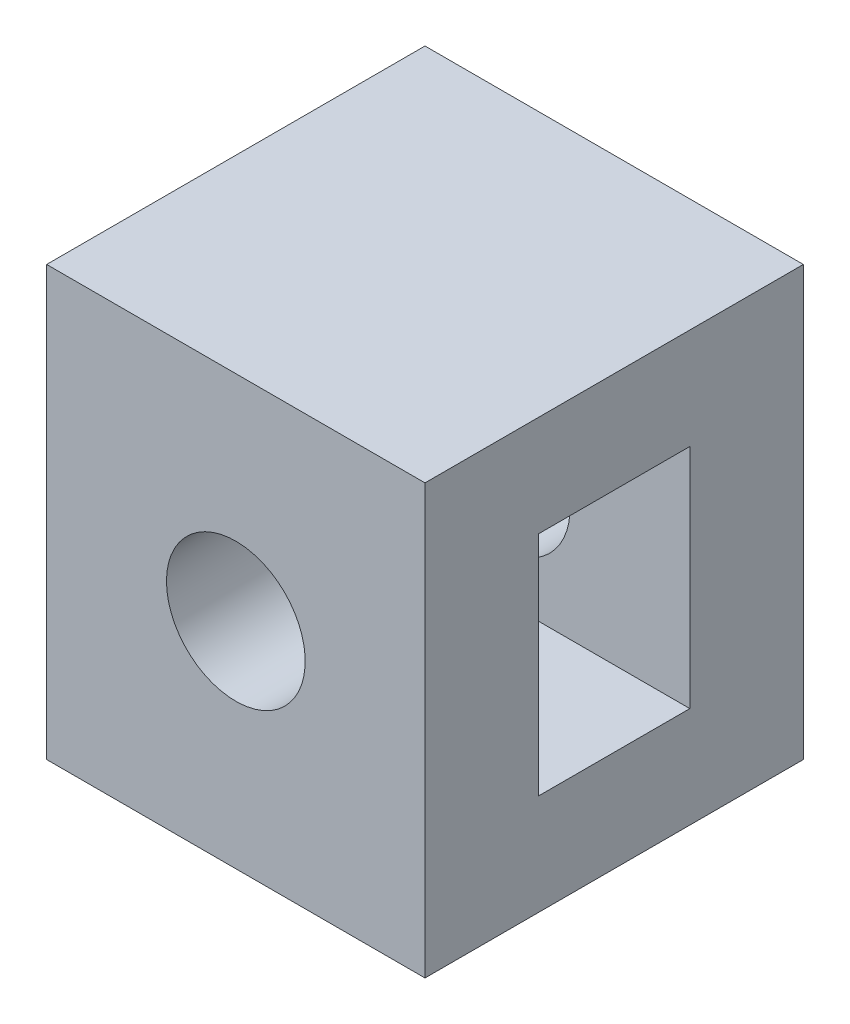
ISO-10303-21;
HEADER;
FILE_DESCRIPTION(('STEP AP214'),'2;1');
FILE_NAME('part.step','',(''),(''),'','','');
FILE_SCHEMA(('AUTOMOTIVE_DESIGN { 1 0 10303 214 1 1 1 1 }'));
ENDSEC;
DATA;
#1=APPLICATION_CONTEXT('core data for automotive mechanical design processes');
#2=APPLICATION_PROTOCOL_DEFINITION('international standard','automotive_design',2000,#1);
#3=PRODUCT_CONTEXT('',#1,'mechanical');
#4=PRODUCT('Part','Part','',(#3));
#5=PRODUCT_RELATED_PRODUCT_CATEGORY('part','',(#4));
#6=PRODUCT_DEFINITION_FORMATION('','',#4);
#7=PRODUCT_DEFINITION_CONTEXT('part definition',#1,'design');
#8=PRODUCT_DEFINITION('design','',#6,#7);
#9=PRODUCT_DEFINITION_SHAPE('','',#8);
#10=(LENGTH_UNIT() NAMED_UNIT(*) SI_UNIT(.MILLI.,.METRE.));
#11=(NAMED_UNIT(*) PLANE_ANGLE_UNIT() SI_UNIT($,.RADIAN.));
#12=(NAMED_UNIT(*) SI_UNIT($,.STERADIAN.) SOLID_ANGLE_UNIT());
#13=UNCERTAINTY_MEASURE_WITH_UNIT(LENGTH_MEASURE(1.E-05),#10,'distance_accuracy_value','');
#14=(GEOMETRIC_REPRESENTATION_CONTEXT(3) GLOBAL_UNCERTAINTY_ASSIGNED_CONTEXT((#13)) GLOBAL_UNIT_ASSIGNED_CONTEXT((#10,
#11,#12)) REPRESENTATION_CONTEXT('',''));
#15=CARTESIAN_POINT('',(0.,0.,0.));
#16=DIRECTION('',(0.,0.,1.));
#17=DIRECTION('',(1.,0.,0.));
#18=AXIS2_PLACEMENT_3D('',#15,#16,#17);
#19=CARTESIAN_POINT('',(0.,17.,15.));
#20=DIRECTION('',(1.,0.,0.));
#21=DIRECTION('',(0.,0.,-1.));
#22=AXIS2_PLACEMENT_3D('',#19,#20,#21);
#23=PLANE('',#22);
#24=DIRECTION('',(0.,0.,1.));
#25=VECTOR('',#24,1.);
#26=CARTESIAN_POINT('',(0.,0.,15.));
#27=LINE('',#26,#25);
#28=CARTESIAN_POINT('',(0.,0.,0.));
#29=VERTEX_POINT('',#28);
#30=CARTESIAN_POINT('',(0.,0.,15.));
#31=VERTEX_POINT('',#30);
#32=EDGE_CURVE('E149',#29,#31,#27,.T.);
#33=ORIENTED_EDGE('',*,*,#32,.T.);
#34=DIRECTION('',(0.,-1.,0.));
#35=VECTOR('',#34,1.);
#36=CARTESIAN_POINT('',(0.,17.,15.));
#37=LINE('',#36,#35);
#38=CARTESIAN_POINT('',(0.,17.,15.));
#39=VERTEX_POINT('',#38);
#40=EDGE_CURVE('E11',#39,#31,#37,.T.);
#41=ORIENTED_EDGE('',*,*,#40,.F.);
#42=DIRECTION('',(0.,0.,1.));
#43=VECTOR('',#42,1.);
#44=CARTESIAN_POINT('',(0.,17.,15.));
#45=LINE('',#44,#43);
#46=CARTESIAN_POINT('',(0.,17.,0.));
#47=VERTEX_POINT('',#46);
#48=EDGE_CURVE('E153',#47,#39,#45,.T.);
#49=ORIENTED_EDGE('',*,*,#48,.F.);
#50=DIRECTION('',(0.,-1.,0.));
#51=VECTOR('',#50,1.);
#52=CARTESIAN_POINT('',(0.,17.,0.));
#53=LINE('',#52,#51);
#54=EDGE_CURVE('E159',#47,#29,#53,.T.);
#55=ORIENTED_EDGE('',*,*,#54,.T.);
#56=EDGE_LOOP('',(#33,#41,#49,#55));
#57=FACE_BOUND('',#56,.T.);
#58=ADVANCED_FACE('F37',(#57),#23,.F.);
#59=CARTESIAN_POINT('',(15.,17.,15.));
#60=DIRECTION('',(0.,0.,-1.));
#61=DIRECTION('',(-1.,0.,0.));
#62=AXIS2_PLACEMENT_3D('',#59,#60,#61);
#63=PLANE('',#62);
#64=CARTESIAN_POINT('',(7.5,8.5,15.));
#65=DIRECTION('',(0.,0.,-1.));
#66=DIRECTION('',(-1.,0.,0.));
#67=AXIS2_PLACEMENT_3D('',#64,#65,#66);
#68=CIRCLE('',#67,2.75);
#69=CARTESIAN_POINT('',(4.75,8.5,15.));
#70=VERTEX_POINT('',#69);
#71=EDGE_CURVE('E208',#70,#70,#68,.T.);
#72=ORIENTED_EDGE('',*,*,#71,.T.);
#73=EDGE_LOOP('',(#72));
#74=FACE_BOUND('',#73,.T.);
#75=DIRECTION('',(1.,0.,0.));
#76=VECTOR('',#75,1.);
#77=CARTESIAN_POINT('',(15.,0.,15.));
#78=LINE('',#77,#76);
#79=CARTESIAN_POINT('',(15.,0.,15.));
#80=VERTEX_POINT('',#79);
#81=EDGE_CURVE('E162',#31,#80,#78,.T.);
#82=ORIENTED_EDGE('',*,*,#81,.T.);
#83=DIRECTION('',(0.,-1.,0.));
#84=VECTOR('',#83,1.);
#85=CARTESIAN_POINT('',(15.,17.,15.));
#86=LINE('',#85,#84);
#87=CARTESIAN_POINT('',(15.,17.,15.));
#88=VERTEX_POINT('',#87);
#89=EDGE_CURVE('E45',#88,#80,#86,.T.);
#90=ORIENTED_EDGE('',*,*,#89,.F.);
#91=DIRECTION('',(1.,0.,0.));
#92=VECTOR('',#91,1.);
#93=CARTESIAN_POINT('',(15.,17.,15.));
#94=LINE('',#93,#92);
#95=EDGE_CURVE('E89',#39,#88,#94,.T.);
#96=ORIENTED_EDGE('',*,*,#95,.F.);
#97=ORIENTED_EDGE('',*,*,#40,.T.);
#98=EDGE_LOOP('',(#82,#90,#96,#97));
#99=FACE_BOUND('',#98,.T.);
#100=ADVANCED_FACE('F194',(#74,#99),#63,.F.);
#101=CARTESIAN_POINT('',(15.,17.,0.));
#102=DIRECTION('',(-1.,0.,0.));
#103=DIRECTION('',(0.,0.,1.));
#104=AXIS2_PLACEMENT_3D('',#101,#102,#103);
#105=PLANE('',#104);
#106=DIRECTION('',(0.,0.,-1.));
#107=VECTOR('',#106,1.);
#108=CARTESIAN_POINT('',(15.,4.,10.5));
#109=LINE('',#108,#107);
#110=CARTESIAN_POINT('',(15.,4.,10.5));
#111=VERTEX_POINT('',#110);
#112=CARTESIAN_POINT('',(15.,4.,4.5));
#113=VERTEX_POINT('',#112);
#114=EDGE_CURVE('E143',#111,#113,#109,.T.);
#115=ORIENTED_EDGE('',*,*,#114,.F.);
#116=DIRECTION('',(0.,-1.,0.));
#117=VECTOR('',#116,1.);
#118=CARTESIAN_POINT('',(15.,13.,10.5));
#119=LINE('',#118,#117);
#120=CARTESIAN_POINT('',(15.,13.,10.5));
#121=VERTEX_POINT('',#120);
#122=EDGE_CURVE('E52',#121,#111,#119,.T.);
#123=ORIENTED_EDGE('',*,*,#122,.F.);
#124=DIRECTION('',(0.,0.,1.));
#125=VECTOR('',#124,1.);
#126=CARTESIAN_POINT('',(15.,13.,4.5));
#127=LINE('',#126,#125);
#128=CARTESIAN_POINT('',(15.,13.,4.5));
#129=VERTEX_POINT('',#128);
#130=EDGE_CURVE('E131',#129,#121,#127,.T.);
#131=ORIENTED_EDGE('',*,*,#130,.F.);
#132=DIRECTION('',(0.,1.,0.));
#133=VECTOR('',#132,1.);
#134=CARTESIAN_POINT('',(15.,4.,4.5));
#135=LINE('',#134,#133);
#136=EDGE_CURVE('E134',#113,#129,#135,.T.);
#137=ORIENTED_EDGE('',*,*,#136,.F.);
#138=EDGE_LOOP('',(#115,#123,#131,#137));
#139=FACE_BOUND('',#138,.T.);
#140=DIRECTION('',(0.,0.,-1.));
#141=VECTOR('',#140,1.);
#142=CARTESIAN_POINT('',(15.,0.,0.));
#143=LINE('',#142,#141);
#144=CARTESIAN_POINT('',(15.,0.,0.));
#145=VERTEX_POINT('',#144);
#146=EDGE_CURVE('E164',#80,#145,#143,.T.);
#147=ORIENTED_EDGE('',*,*,#146,.T.);
#148=DIRECTION('',(0.,-1.,0.));
#149=VECTOR('',#148,1.);
#150=CARTESIAN_POINT('',(15.,17.,0.));
#151=LINE('',#150,#149);
#152=CARTESIAN_POINT('',(15.,17.,0.));
#153=VERTEX_POINT('',#152);
#154=EDGE_CURVE('E168',#153,#145,#151,.T.);
#155=ORIENTED_EDGE('',*,*,#154,.F.);
#156=DIRECTION('',(0.,0.,-1.));
#157=VECTOR('',#156,1.);
#158=CARTESIAN_POINT('',(15.,17.,0.));
#159=LINE('',#158,#157);
#160=EDGE_CURVE('E156',#88,#153,#159,.T.);
#161=ORIENTED_EDGE('',*,*,#160,.F.);
#162=ORIENTED_EDGE('',*,*,#89,.T.);
#163=EDGE_LOOP('',(#147,#155,#161,#162));
#164=FACE_BOUND('',#163,.T.);
#165=ADVANCED_FACE('F174',(#139,#164),#105,.F.);
#166=CARTESIAN_POINT('',(0.,17.,0.));
#167=DIRECTION('',(0.,0.,1.));
#168=DIRECTION('',(1.,0.,0.));
#169=AXIS2_PLACEMENT_3D('',#166,#167,#168);
#170=PLANE('',#169);
#171=CARTESIAN_POINT('',(7.5,8.5,0.));
#172=DIRECTION('',(0.,0.,-1.));
#173=DIRECTION('',(-1.,0.,0.));
#174=AXIS2_PLACEMENT_3D('',#171,#172,#173);
#175=CIRCLE('',#174,2.75);
#176=CARTESIAN_POINT('',(4.75,8.5,0.));
#177=VERTEX_POINT('',#176);
#178=EDGE_CURVE('E210',#177,#177,#175,.T.);
#179=ORIENTED_EDGE('',*,*,#178,.F.);
#180=EDGE_LOOP('',(#179));
#181=FACE_BOUND('',#180,.T.);
#182=DIRECTION('',(-1.,0.,0.));
#183=VECTOR('',#182,1.);
#184=CARTESIAN_POINT('',(0.,0.,0.));
#185=LINE('',#184,#183);
#186=EDGE_CURVE('E82',#145,#29,#185,.T.);
#187=ORIENTED_EDGE('',*,*,#186,.T.);
#188=ORIENTED_EDGE('',*,*,#54,.F.);
#189=DIRECTION('',(-1.,0.,0.));
#190=VECTOR('',#189,1.);
#191=CARTESIAN_POINT('',(0.,17.,0.));
#192=LINE('',#191,#190);
#193=EDGE_CURVE('E61',#153,#47,#192,.T.);
#194=ORIENTED_EDGE('',*,*,#193,.F.);
#195=ORIENTED_EDGE('',*,*,#154,.T.);
#196=EDGE_LOOP('',(#187,#188,#194,#195));
#197=FACE_BOUND('',#196,.T.);
#198=ADVANCED_FACE('F182',(#181,#197),#170,.F.);
#199=CARTESIAN_POINT('',(0.,17.,0.));
#200=DIRECTION('',(0.,-1.,0.));
#201=DIRECTION('',(0.,0.,-1.));
#202=AXIS2_PLACEMENT_3D('',#199,#200,#201);
#203=PLANE('',#202);
#204=ORIENTED_EDGE('',*,*,#48,.T.);
#205=ORIENTED_EDGE('',*,*,#95,.T.);
#206=ORIENTED_EDGE('',*,*,#160,.T.);
#207=ORIENTED_EDGE('',*,*,#193,.T.);
#208=EDGE_LOOP('',(#204,#205,#206,#207));
#209=FACE_BOUND('',#208,.T.);
#210=ADVANCED_FACE('F184',(#209),#203,.F.);
#211=CARTESIAN_POINT('',(0.,0.,0.));
#212=DIRECTION('',(0.,-1.,0.));
#213=DIRECTION('',(0.,0.,-1.));
#214=AXIS2_PLACEMENT_3D('',#211,#212,#213);
#215=PLANE('',#214);
#216=ORIENTED_EDGE('',*,*,#32,.F.);
#217=ORIENTED_EDGE('',*,*,#186,.F.);
#218=ORIENTED_EDGE('',*,*,#146,.F.);
#219=ORIENTED_EDGE('',*,*,#81,.F.);
#220=EDGE_LOOP('',(#216,#217,#218,#219));
#221=FACE_BOUND('',#220,.T.);
#222=ADVANCED_FACE('F178',(#221),#215,.T.);
#223=CARTESIAN_POINT('',(3.,13.,10.5));
#224=DIRECTION('',(0.,0.,1.));
#225=DIRECTION('',(1.,0.,0.));
#226=AXIS2_PLACEMENT_3D('',#223,#224,#225);
#227=PLANE('',#226);
#228=CARTESIAN_POINT('',(7.5,8.5,10.5));
#229=DIRECTION('',(0.,0.,1.));
#230=DIRECTION('',(1.,0.,0.));
#231=AXIS2_PLACEMENT_3D('',#228,#229,#230);
#232=CIRCLE('',#231,2.75);
#233=CARTESIAN_POINT('',(10.25,8.5,10.5));
#234=VERTEX_POINT('',#233);
#235=EDGE_CURVE('E137',#234,#234,#232,.T.);
#236=ORIENTED_EDGE('',*,*,#235,.T.);
#237=EDGE_LOOP('',(#236));
#238=FACE_BOUND('',#237,.T.);
#239=ORIENTED_EDGE('',*,*,#122,.T.);
#240=DIRECTION('',(1.,0.,0.));
#241=VECTOR('',#240,1.);
#242=CARTESIAN_POINT('',(3.,4.,10.5));
#243=LINE('',#242,#241);
#244=CARTESIAN_POINT('',(3.,4.,10.5));
#245=VERTEX_POINT('',#244);
#246=EDGE_CURVE('E109',#245,#111,#243,.T.);
#247=ORIENTED_EDGE('',*,*,#246,.F.);
#248=DIRECTION('',(0.,-1.,0.));
#249=VECTOR('',#248,1.);
#250=CARTESIAN_POINT('',(3.,13.,10.5));
#251=LINE('',#250,#249);
#252=CARTESIAN_POINT('',(3.,13.,10.5));
#253=VERTEX_POINT('',#252);
#254=EDGE_CURVE('E113',#253,#245,#251,.T.);
#255=ORIENTED_EDGE('',*,*,#254,.F.);
#256=DIRECTION('',(1.,0.,0.));
#257=VECTOR('',#256,1.);
#258=CARTESIAN_POINT('',(3.,13.,10.5));
#259=LINE('',#258,#257);
#260=EDGE_CURVE('E147',#253,#121,#259,.T.);
#261=ORIENTED_EDGE('',*,*,#260,.T.);
#262=EDGE_LOOP('',(#239,#247,#255,#261));
#263=FACE_BOUND('',#262,.T.);
#264=ADVANCED_FACE('F111',(#238,#263),#227,.F.);
#265=CARTESIAN_POINT('',(3.,13.,4.5));
#266=DIRECTION('',(0.,1.,0.));
#267=DIRECTION('',(0.,0.,1.));
#268=AXIS2_PLACEMENT_3D('',#265,#266,#267);
#269=PLANE('',#268);
#270=ORIENTED_EDGE('',*,*,#130,.T.);
#271=ORIENTED_EDGE('',*,*,#260,.F.);
#272=DIRECTION('',(0.,0.,1.));
#273=VECTOR('',#272,1.);
#274=CARTESIAN_POINT('',(3.,13.,4.5));
#275=LINE('',#274,#273);
#276=CARTESIAN_POINT('',(3.,13.,4.5));
#277=VERTEX_POINT('',#276);
#278=EDGE_CURVE('E119',#277,#253,#275,.T.);
#279=ORIENTED_EDGE('',*,*,#278,.F.);
#280=DIRECTION('',(1.,0.,0.));
#281=VECTOR('',#280,1.);
#282=CARTESIAN_POINT('',(3.,13.,4.5));
#283=LINE('',#282,#281);
#284=EDGE_CURVE('E150',#277,#129,#283,.T.);
#285=ORIENTED_EDGE('',*,*,#284,.T.);
#286=EDGE_LOOP('',(#270,#271,#279,#285));
#287=FACE_BOUND('',#286,.T.);
#288=ADVANCED_FACE('F225',(#287),#269,.F.);
#289=CARTESIAN_POINT('',(3.,4.,4.5));
#290=DIRECTION('',(0.,0.,-1.));
#291=DIRECTION('',(-1.,0.,0.));
#292=AXIS2_PLACEMENT_3D('',#289,#290,#291);
#293=PLANE('',#292);
#294=CARTESIAN_POINT('',(7.5,8.5,4.5));
#295=DIRECTION('',(0.,0.,-1.));
#296=DIRECTION('',(-1.,0.,0.));
#297=AXIS2_PLACEMENT_3D('',#294,#295,#296);
#298=CIRCLE('',#297,2.75);
#299=CARTESIAN_POINT('',(4.75,8.5,4.5));
#300=VERTEX_POINT('',#299);
#301=EDGE_CURVE('E40',#300,#300,#298,.T.);
#302=ORIENTED_EDGE('',*,*,#301,.T.);
#303=EDGE_LOOP('',(#302));
#304=FACE_BOUND('',#303,.T.);
#305=ORIENTED_EDGE('',*,*,#136,.T.);
#306=ORIENTED_EDGE('',*,*,#284,.F.);
#307=DIRECTION('',(0.,1.,0.));
#308=VECTOR('',#307,1.);
#309=CARTESIAN_POINT('',(3.,4.,4.5));
#310=LINE('',#309,#308);
#311=CARTESIAN_POINT('',(3.,4.,4.5));
#312=VERTEX_POINT('',#311);
#313=EDGE_CURVE('E127',#312,#277,#310,.T.);
#314=ORIENTED_EDGE('',*,*,#313,.F.);
#315=DIRECTION('',(1.,0.,0.));
#316=VECTOR('',#315,1.);
#317=CARTESIAN_POINT('',(3.,4.,4.5));
#318=LINE('',#317,#316);
#319=EDGE_CURVE('E118',#312,#113,#318,.T.);
#320=ORIENTED_EDGE('',*,*,#319,.T.);
#321=EDGE_LOOP('',(#305,#306,#314,#320));
#322=FACE_BOUND('',#321,.T.);
#323=ADVANCED_FACE('F222',(#304,#322),#293,.F.);
#324=CARTESIAN_POINT('',(3.,4.,10.5));
#325=DIRECTION('',(0.,-1.,0.));
#326=DIRECTION('',(0.,0.,-1.));
#327=AXIS2_PLACEMENT_3D('',#324,#325,#326);
#328=PLANE('',#327);
#329=ORIENTED_EDGE('',*,*,#114,.T.);
#330=ORIENTED_EDGE('',*,*,#319,.F.);
#331=DIRECTION('',(0.,0.,-1.));
#332=VECTOR('',#331,1.);
#333=CARTESIAN_POINT('',(3.,4.,10.5));
#334=LINE('',#333,#332);
#335=EDGE_CURVE('E122',#245,#312,#334,.T.);
#336=ORIENTED_EDGE('',*,*,#335,.F.);
#337=ORIENTED_EDGE('',*,*,#246,.T.);
#338=EDGE_LOOP('',(#329,#330,#336,#337));
#339=FACE_BOUND('',#338,.T.);
#340=ADVANCED_FACE('F123',(#339),#328,.F.);
#341=CARTESIAN_POINT('',(3.,0.,0.));
#342=DIRECTION('',(1.,0.,0.));
#343=DIRECTION('',(0.,0.,-1.));
#344=AXIS2_PLACEMENT_3D('',#341,#342,#343);
#345=PLANE('',#344);
#346=ORIENTED_EDGE('',*,*,#254,.T.);
#347=ORIENTED_EDGE('',*,*,#335,.T.);
#348=ORIENTED_EDGE('',*,*,#313,.T.);
#349=ORIENTED_EDGE('',*,*,#278,.T.);
#350=EDGE_LOOP('',(#346,#347,#348,#349));
#351=FACE_BOUND('',#350,.T.);
#352=ADVANCED_FACE('F129',(#351),#345,.T.);
#353=CARTESIAN_POINT('',(7.5,8.5,15.));
#354=DIRECTION('',(0.,0.,-1.));
#355=DIRECTION('',(-1.,0.,0.));
#356=AXIS2_PLACEMENT_3D('',#353,#354,#355);
#357=CYLINDRICAL_SURFACE('',#356,2.75);
#358=ORIENTED_EDGE('',*,*,#178,.T.);
#359=EDGE_LOOP('',(#358));
#360=FACE_BOUND('',#359,.T.);
#361=ORIENTED_EDGE('',*,*,#301,.F.);
#362=EDGE_LOOP('',(#361));
#363=FACE_BOUND('',#362,.T.);
#364=ADVANCED_FACE('F215',(#360,#363),#357,.F.);
#365=ORIENTED_EDGE('',*,*,#71,.F.);
#366=EDGE_LOOP('',(#365));
#367=FACE_BOUND('',#366,.T.);
#368=ORIENTED_EDGE('',*,*,#235,.F.);
#369=EDGE_LOOP('',(#368));
#370=FACE_BOUND('',#369,.T.);
#371=ADVANCED_FACE('F218',(#367,#370),#357,.F.);
#372=CLOSED_SHELL('',(#58,#100,#165,#198,#210,#222,#264,#288,#323,#340,#352,#364,#371));
#373=MANIFOLD_SOLID_BREP('B2',#372);
#374=ADVANCED_BREP_SHAPE_REPRESENTATION('',(#18,#373),#14);
#375=SHAPE_DEFINITION_REPRESENTATION(#9,#374);
ENDSEC;
END-ISO-10303-21;
